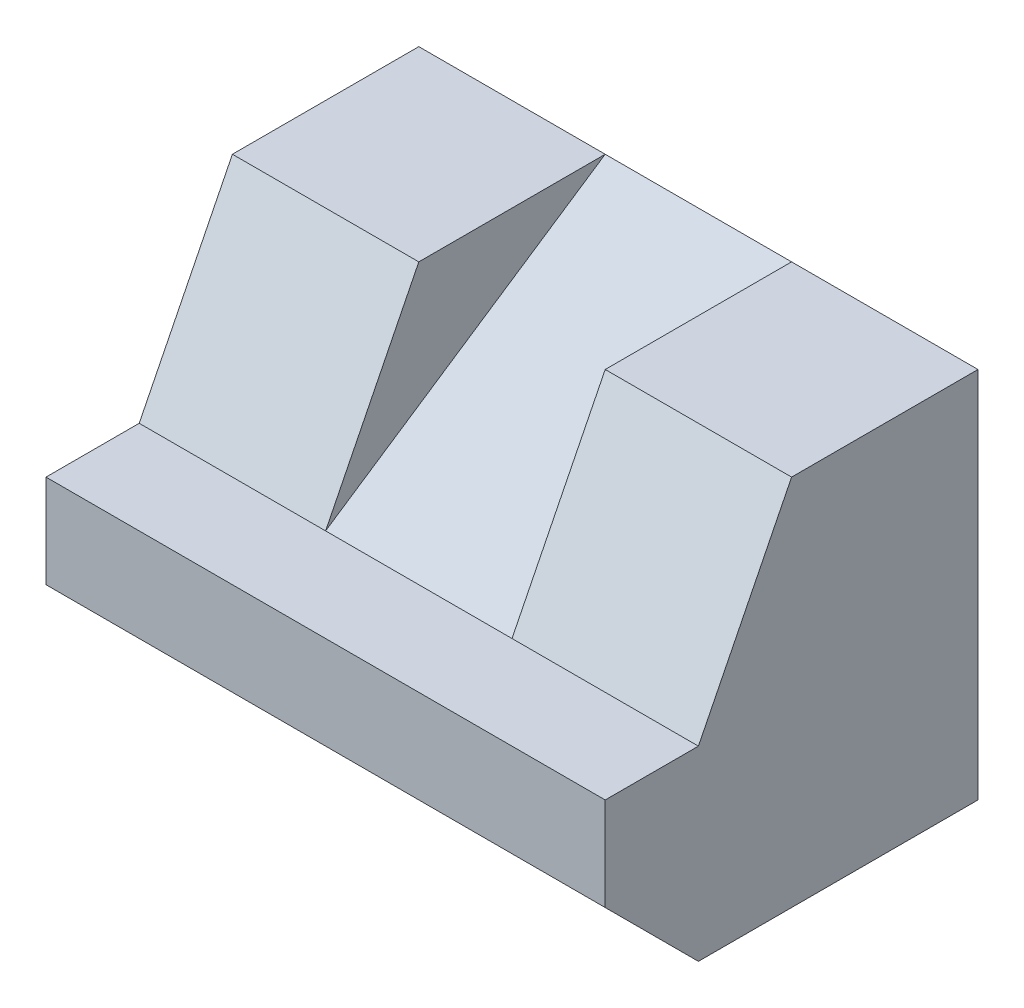
ISO-10303-21;
HEADER;
FILE_DESCRIPTION(('STEP AP214'),'2;1');
FILE_NAME('part.step','',(''),(''),'','','');
FILE_SCHEMA(('AUTOMOTIVE_DESIGN { 1 0 10303 214 1 1 1 1 }'));
ENDSEC;
DATA;
#1=APPLICATION_CONTEXT('core data for automotive mechanical design processes');
#2=APPLICATION_PROTOCOL_DEFINITION('international standard','automotive_design',2000,#1);
#3=PRODUCT_CONTEXT('',#1,'mechanical');
#4=PRODUCT('Part','Part','',(#3));
#5=PRODUCT_RELATED_PRODUCT_CATEGORY('part','',(#4));
#6=PRODUCT_DEFINITION_FORMATION('','',#4);
#7=PRODUCT_DEFINITION_CONTEXT('part definition',#1,'design');
#8=PRODUCT_DEFINITION('design','',#6,#7);
#9=PRODUCT_DEFINITION_SHAPE('','',#8);
#10=(LENGTH_UNIT() NAMED_UNIT(*) SI_UNIT(.MILLI.,.METRE.));
#11=(NAMED_UNIT(*) PLANE_ANGLE_UNIT() SI_UNIT($,.RADIAN.));
#12=(NAMED_UNIT(*) SI_UNIT($,.STERADIAN.) SOLID_ANGLE_UNIT());
#13=UNCERTAINTY_MEASURE_WITH_UNIT(LENGTH_MEASURE(1.E-05),#10,'distance_accuracy_value','');
#14=(GEOMETRIC_REPRESENTATION_CONTEXT(3) GLOBAL_UNCERTAINTY_ASSIGNED_CONTEXT((#13)) GLOBAL_UNIT_ASSIGNED_CONTEXT((#10,
#11,#12)) REPRESENTATION_CONTEXT('',''));
#15=CARTESIAN_POINT('',(0.,0.,0.));
#16=DIRECTION('',(0.,0.,1.));
#17=DIRECTION('',(1.,0.,0.));
#18=AXIS2_PLACEMENT_3D('',#15,#16,#17);
#19=CARTESIAN_POINT('',(76.2,50.8,-38.1));
#20=DIRECTION('',(0.,-1.,0.));
#21=DIRECTION('',(0.,0.,-1.));
#22=AXIS2_PLACEMENT_3D('',#19,#20,#21);
#23=PLANE('',#22);
#24=DIRECTION('',(0.,0.,1.));
#25=VECTOR('',#24,1.);
#26=CARTESIAN_POINT('',(50.8,50.8,-38.1));
#27=LINE('',#26,#25);
#28=CARTESIAN_POINT('',(50.8,50.8,-38.1));
#29=VERTEX_POINT('',#28);
#30=CARTESIAN_POINT('',(50.8,50.8,-12.7));
#31=VERTEX_POINT('',#30);
#32=EDGE_CURVE('E208',#29,#31,#27,.T.);
#33=ORIENTED_EDGE('',*,*,#32,.T.);
#34=DIRECTION('',(-1.,0.,0.));
#35=VECTOR('',#34,1.);
#36=CARTESIAN_POINT('',(76.2,50.8,-12.7));
#37=LINE('',#36,#35);
#38=CARTESIAN_POINT('',(76.2,50.8,-12.7));
#39=VERTEX_POINT('',#38);
#40=EDGE_CURVE('E168',#39,#31,#37,.T.);
#41=ORIENTED_EDGE('',*,*,#40,.F.);
#42=DIRECTION('',(0.,0.,1.));
#43=VECTOR('',#42,1.);
#44=CARTESIAN_POINT('',(76.2,50.8,-38.1));
#45=LINE('',#44,#43);
#46=CARTESIAN_POINT('',(76.2,50.8,-38.1));
#47=VERTEX_POINT('',#46);
#48=EDGE_CURVE('E123',#47,#39,#45,.T.);
#49=ORIENTED_EDGE('',*,*,#48,.F.);
#50=DIRECTION('',(-1.,0.,0.));
#51=VECTOR('',#50,1.);
#52=CARTESIAN_POINT('',(76.2,50.8,-38.1));
#53=LINE('',#52,#51);
#54=EDGE_CURVE('E171',#47,#29,#53,.T.);
#55=ORIENTED_EDGE('',*,*,#54,.T.);
#56=EDGE_LOOP('',(#33,#41,#49,#55));
#57=FACE_BOUND('',#56,.T.);
#58=ADVANCED_FACE('F41',(#57),#23,.F.);
#59=CARTESIAN_POINT('',(76.2,50.8,-12.7));
#60=DIRECTION('',(0.,-0.447213595499958,-0.894427190999916));
#61=DIRECTION('',(0.,0.894427190999916,-0.447213595499958));
#62=AXIS2_PLACEMENT_3D('',#59,#60,#61);
#63=PLANE('',#62);
#64=DIRECTION('',(0.,-0.894427190999916,0.447213595499958));
#65=VECTOR('',#64,1.);
#66=CARTESIAN_POINT('',(50.8,50.8,-12.7));
#67=LINE('',#66,#65);
#68=CARTESIAN_POINT('',(50.8,25.4,0.));
#69=VERTEX_POINT('',#68);
#70=EDGE_CURVE('E134',#31,#69,#67,.T.);
#71=ORIENTED_EDGE('',*,*,#70,.T.);
#72=DIRECTION('',(-1.,0.,0.));
#73=VECTOR('',#72,1.);
#74=CARTESIAN_POINT('',(76.2,25.4,0.));
#75=LINE('',#74,#73);
#76=CARTESIAN_POINT('',(76.2,25.4,0.));
#77=VERTEX_POINT('',#76);
#78=EDGE_CURVE('E130',#77,#69,#75,.T.);
#79=ORIENTED_EDGE('',*,*,#78,.F.);
#80=DIRECTION('',(0.,-0.894427190999916,0.447213595499958));
#81=VECTOR('',#80,1.);
#82=CARTESIAN_POINT('',(76.2,50.8,-12.7));
#83=LINE('',#82,#81);
#84=EDGE_CURVE('E116',#39,#77,#83,.T.);
#85=ORIENTED_EDGE('',*,*,#84,.F.);
#86=ORIENTED_EDGE('',*,*,#40,.T.);
#87=EDGE_LOOP('',(#71,#79,#85,#86));
#88=FACE_BOUND('',#87,.T.);
#89=ADVANCED_FACE('F131',(#88),#63,.F.);
#90=CARTESIAN_POINT('',(76.2,12.7,12.7));
#91=DIRECTION('',(0.,0.707106781186547,-0.707106781186548));
#92=DIRECTION('',(0.,0.707106781186548,0.707106781186547));
#93=AXIS2_PLACEMENT_3D('',#90,#91,#92);
#94=PLANE('',#93);
#95=DIRECTION('',(0.,-0.707106781186548,-0.707106781186547));
#96=VECTOR('',#95,1.);
#97=CARTESIAN_POINT('',(0.,12.7,12.7));
#98=LINE('',#97,#96);
#99=CARTESIAN_POINT('',(0.,12.7,12.7));
#100=VERTEX_POINT('',#99);
#101=CARTESIAN_POINT('',(0.,0.,0.));
#102=VERTEX_POINT('',#101);
#103=EDGE_CURVE('E147',#100,#102,#98,.T.);
#104=ORIENTED_EDGE('',*,*,#103,.T.);
#105=DIRECTION('',(-1.,0.,0.));
#106=VECTOR('',#105,1.);
#107=CARTESIAN_POINT('',(76.2,0.,0.));
#108=LINE('',#107,#106);
#109=CARTESIAN_POINT('',(76.2,0.,0.));
#110=VERTEX_POINT('',#109);
#111=EDGE_CURVE('E11',#110,#102,#108,.T.);
#112=ORIENTED_EDGE('',*,*,#111,.F.);
#113=DIRECTION('',(0.,-0.707106781186548,-0.707106781186547));
#114=VECTOR('',#113,1.);
#115=CARTESIAN_POINT('',(76.2,12.7,12.7));
#116=LINE('',#115,#114);
#117=CARTESIAN_POINT('',(76.2,12.7,12.7));
#118=VERTEX_POINT('',#117);
#119=EDGE_CURVE('E165',#118,#110,#116,.T.);
#120=ORIENTED_EDGE('',*,*,#119,.F.);
#121=DIRECTION('',(-1.,0.,0.));
#122=VECTOR('',#121,1.);
#123=CARTESIAN_POINT('',(76.2,12.7,12.7));
#124=LINE('',#123,#122);
#125=EDGE_CURVE('E143',#118,#100,#124,.T.);
#126=ORIENTED_EDGE('',*,*,#125,.T.);
#127=EDGE_LOOP('',(#104,#112,#120,#126));
#128=FACE_BOUND('',#127,.T.);
#129=ADVANCED_FACE('F43',(#128),#94,.F.);
#130=CARTESIAN_POINT('',(76.2,0.,0.));
#131=DIRECTION('',(0.,1.,0.));
#132=DIRECTION('',(0.,0.,1.));
#133=AXIS2_PLACEMENT_3D('',#130,#131,#132);
#134=PLANE('',#133);
#135=DIRECTION('',(0.,0.,-1.));
#136=VECTOR('',#135,1.);
#137=CARTESIAN_POINT('',(0.,0.,0.));
#138=LINE('',#137,#136);
#139=CARTESIAN_POINT('',(0.,0.,-38.1));
#140=VERTEX_POINT('',#139);
#141=EDGE_CURVE('E150',#102,#140,#138,.T.);
#142=ORIENTED_EDGE('',*,*,#141,.T.);
#143=DIRECTION('',(-1.,0.,0.));
#144=VECTOR('',#143,1.);
#145=CARTESIAN_POINT('',(76.2,0.,-38.1));
#146=LINE('',#145,#144);
#147=CARTESIAN_POINT('',(76.2,0.,-38.1));
#148=VERTEX_POINT('',#147);
#149=EDGE_CURVE('E49',#148,#140,#146,.T.);
#150=ORIENTED_EDGE('',*,*,#149,.F.);
#151=DIRECTION('',(0.,0.,-1.));
#152=VECTOR('',#151,1.);
#153=CARTESIAN_POINT('',(76.2,0.,0.));
#154=LINE('',#153,#152);
#155=EDGE_CURVE('E103',#110,#148,#154,.T.);
#156=ORIENTED_EDGE('',*,*,#155,.F.);
#157=ORIENTED_EDGE('',*,*,#111,.T.);
#158=EDGE_LOOP('',(#142,#150,#156,#157));
#159=FACE_BOUND('',#158,.T.);
#160=ADVANCED_FACE('F234',(#159),#134,.F.);
#161=CARTESIAN_POINT('',(76.2,0.,-38.1));
#162=DIRECTION('',(0.,0.,1.));
#163=DIRECTION('',(1.,0.,0.));
#164=AXIS2_PLACEMENT_3D('',#161,#162,#163);
#165=PLANE('',#164);
#166=DIRECTION('',(0.,1.,0.));
#167=VECTOR('',#166,1.);
#168=CARTESIAN_POINT('',(0.,0.,-38.1));
#169=LINE('',#168,#167);
#170=CARTESIAN_POINT('',(0.,50.8,-38.1));
#171=VERTEX_POINT('',#170);
#172=EDGE_CURVE('E153',#140,#171,#169,.T.);
#173=ORIENTED_EDGE('',*,*,#172,.T.);
#174=CARTESIAN_POINT('',(25.4,50.8,-38.1));
#175=VERTEX_POINT('',#174);
#176=EDGE_CURVE('E170',#175,#171,#53,.T.);
#177=ORIENTED_EDGE('',*,*,#176,.F.);
#178=DIRECTION('',(1.,0.,0.));
#179=VECTOR('',#178,1.);
#180=CARTESIAN_POINT('',(25.4,50.8,-38.1));
#181=LINE('',#180,#179);
#182=EDGE_CURVE('E151',#175,#29,#181,.T.);
#183=ORIENTED_EDGE('',*,*,#182,.T.);
#184=ORIENTED_EDGE('',*,*,#54,.F.);
#185=DIRECTION('',(0.,1.,0.));
#186=VECTOR('',#185,1.);
#187=CARTESIAN_POINT('',(76.2,0.,-38.1));
#188=LINE('',#187,#186);
#189=EDGE_CURVE('E181',#148,#47,#188,.T.);
#190=ORIENTED_EDGE('',*,*,#189,.F.);
#191=ORIENTED_EDGE('',*,*,#149,.T.);
#192=EDGE_LOOP('',(#173,#177,#183,#184,#190,#191));
#193=FACE_BOUND('',#192,.T.);
#194=ADVANCED_FACE('F177',(#193),#165,.F.);
#195=CARTESIAN_POINT('',(25.4,50.8,-12.7));
#196=VERTEX_POINT('',#195);
#197=CARTESIAN_POINT('',(0.,50.8,-12.7));
#198=VERTEX_POINT('',#197);
#199=EDGE_CURVE('E137',#196,#198,#37,.T.);
#200=ORIENTED_EDGE('',*,*,#199,.F.);
#201=DIRECTION('',(0.,0.,1.));
#202=VECTOR('',#201,1.);
#203=CARTESIAN_POINT('',(25.4,50.8,-38.1));
#204=LINE('',#203,#202);
#205=EDGE_CURVE('E192',#175,#196,#204,.T.);
#206=ORIENTED_EDGE('',*,*,#205,.F.);
#207=ORIENTED_EDGE('',*,*,#176,.T.);
#208=DIRECTION('',(0.,0.,1.));
#209=VECTOR('',#208,1.);
#210=CARTESIAN_POINT('',(0.,50.8,-38.1));
#211=LINE('',#210,#209);
#212=EDGE_CURVE('E156',#171,#198,#211,.T.);
#213=ORIENTED_EDGE('',*,*,#212,.T.);
#214=EDGE_LOOP('',(#200,#206,#207,#213));
#215=FACE_BOUND('',#214,.T.);
#216=ADVANCED_FACE('F189',(#215),#23,.F.);
#217=CARTESIAN_POINT('',(25.4,25.4,0.));
#218=VERTEX_POINT('',#217);
#219=CARTESIAN_POINT('',(0.,25.4,0.));
#220=VERTEX_POINT('',#219);
#221=EDGE_CURVE('E138',#218,#220,#75,.T.);
#222=ORIENTED_EDGE('',*,*,#221,.F.);
#223=DIRECTION('',(0.,-0.894427190999916,0.447213595499958));
#224=VECTOR('',#223,1.);
#225=CARTESIAN_POINT('',(25.4,50.8,-12.7));
#226=LINE('',#225,#224);
#227=EDGE_CURVE('E56',#196,#218,#226,.T.);
#228=ORIENTED_EDGE('',*,*,#227,.F.);
#229=ORIENTED_EDGE('',*,*,#199,.T.);
#230=DIRECTION('',(0.,-0.894427190999916,0.447213595499958));
#231=VECTOR('',#230,1.);
#232=CARTESIAN_POINT('',(0.,50.8,-12.7));
#233=LINE('',#232,#231);
#234=EDGE_CURVE('E159',#198,#220,#233,.T.);
#235=ORIENTED_EDGE('',*,*,#234,.T.);
#236=EDGE_LOOP('',(#222,#228,#229,#235));
#237=FACE_BOUND('',#236,.T.);
#238=ADVANCED_FACE('F227',(#237),#63,.F.);
#239=CARTESIAN_POINT('',(76.2,25.4,0.));
#240=DIRECTION('',(0.,-1.,0.));
#241=DIRECTION('',(0.,0.,-1.));
#242=AXIS2_PLACEMENT_3D('',#239,#240,#241);
#243=PLANE('',#242);
#244=DIRECTION('',(0.,0.,1.));
#245=VECTOR('',#244,1.);
#246=CARTESIAN_POINT('',(0.,25.4,0.));
#247=LINE('',#246,#245);
#248=CARTESIAN_POINT('',(0.,25.4,12.7));
#249=VERTEX_POINT('',#248);
#250=EDGE_CURVE('E162',#220,#249,#247,.T.);
#251=ORIENTED_EDGE('',*,*,#250,.T.);
#252=DIRECTION('',(-1.,0.,0.));
#253=VECTOR('',#252,1.);
#254=CARTESIAN_POINT('',(76.2,25.4,12.7));
#255=LINE('',#254,#253);
#256=CARTESIAN_POINT('',(76.2,25.4,12.7));
#257=VERTEX_POINT('',#256);
#258=EDGE_CURVE('E141',#257,#249,#255,.T.);
#259=ORIENTED_EDGE('',*,*,#258,.F.);
#260=DIRECTION('',(0.,0.,1.));
#261=VECTOR('',#260,1.);
#262=CARTESIAN_POINT('',(76.2,25.4,0.));
#263=LINE('',#262,#261);
#264=EDGE_CURVE('E120',#77,#257,#263,.T.);
#265=ORIENTED_EDGE('',*,*,#264,.F.);
#266=ORIENTED_EDGE('',*,*,#78,.T.);
#267=DIRECTION('',(1.,0.,0.));
#268=VECTOR('',#267,1.);
#269=CARTESIAN_POINT('',(25.4,25.4,0.));
#270=LINE('',#269,#268);
#271=EDGE_CURVE('E206',#218,#69,#270,.T.);
#272=ORIENTED_EDGE('',*,*,#271,.F.);
#273=ORIENTED_EDGE('',*,*,#221,.T.);
#274=EDGE_LOOP('',(#251,#259,#265,#266,#272,#273));
#275=FACE_BOUND('',#274,.T.);
#276=ADVANCED_FACE('F140',(#275),#243,.F.);
#277=CARTESIAN_POINT('',(76.2,25.4,12.7));
#278=DIRECTION('',(0.,0.,-1.));
#279=DIRECTION('',(0.,1.,0.));
#280=AXIS2_PLACEMENT_3D('',#277,#278,#279);
#281=PLANE('',#280);
#282=DIRECTION('',(0.,-1.,0.));
#283=VECTOR('',#282,1.);
#284=CARTESIAN_POINT('',(0.,25.4,12.7));
#285=LINE('',#284,#283);
#286=EDGE_CURVE('E95',#249,#100,#285,.T.);
#287=ORIENTED_EDGE('',*,*,#286,.T.);
#288=ORIENTED_EDGE('',*,*,#125,.F.);
#289=DIRECTION('',(0.,-1.,0.));
#290=VECTOR('',#289,1.);
#291=CARTESIAN_POINT('',(76.2,25.4,12.7));
#292=LINE('',#291,#290);
#293=EDGE_CURVE('E65',#257,#118,#292,.T.);
#294=ORIENTED_EDGE('',*,*,#293,.F.);
#295=ORIENTED_EDGE('',*,*,#258,.T.);
#296=EDGE_LOOP('',(#287,#288,#294,#295));
#297=FACE_BOUND('',#296,.T.);
#298=ADVANCED_FACE('F243',(#297),#281,.F.);
#299=CARTESIAN_POINT('',(76.2,0.,0.));
#300=DIRECTION('',(-1.,0.,0.));
#301=DIRECTION('',(0.,0.,1.));
#302=AXIS2_PLACEMENT_3D('',#299,#300,#301);
#303=PLANE('',#302);
#304=ORIENTED_EDGE('',*,*,#119,.T.);
#305=ORIENTED_EDGE('',*,*,#155,.T.);
#306=ORIENTED_EDGE('',*,*,#189,.T.);
#307=ORIENTED_EDGE('',*,*,#48,.T.);
#308=ORIENTED_EDGE('',*,*,#84,.T.);
#309=ORIENTED_EDGE('',*,*,#264,.T.);
#310=ORIENTED_EDGE('',*,*,#293,.T.);
#311=EDGE_LOOP('',(#304,#305,#306,#307,#308,#309,#310));
#312=FACE_BOUND('',#311,.T.);
#313=ADVANCED_FACE('F118',(#312),#303,.F.);
#314=CARTESIAN_POINT('',(0.,0.,0.));
#315=DIRECTION('',(-1.,0.,0.));
#316=DIRECTION('',(0.,0.,1.));
#317=AXIS2_PLACEMENT_3D('',#314,#315,#316);
#318=PLANE('',#317);
#319=ORIENTED_EDGE('',*,*,#103,.F.);
#320=ORIENTED_EDGE('',*,*,#286,.F.);
#321=ORIENTED_EDGE('',*,*,#250,.F.);
#322=ORIENTED_EDGE('',*,*,#234,.F.);
#323=ORIENTED_EDGE('',*,*,#212,.F.);
#324=ORIENTED_EDGE('',*,*,#172,.F.);
#325=ORIENTED_EDGE('',*,*,#141,.F.);
#326=EDGE_LOOP('',(#319,#320,#321,#322,#323,#324,#325));
#327=FACE_BOUND('',#326,.T.);
#328=ADVANCED_FACE('F184',(#327),#318,.T.);
#329=CARTESIAN_POINT('',(25.4,25.4,0.));
#330=DIRECTION('',(0.,-0.832050294337844,-0.554700196225229));
#331=DIRECTION('',(0.,0.554700196225229,-0.832050294337844));
#332=AXIS2_PLACEMENT_3D('',#329,#330,#331);
#333=PLANE('',#332);
#334=DIRECTION('',(0.,0.554700196225229,-0.832050294337844));
#335=VECTOR('',#334,1.);
#336=CARTESIAN_POINT('',(50.8,25.4,0.));
#337=LINE('',#336,#335);
#338=EDGE_CURVE('E203',#69,#29,#337,.T.);
#339=ORIENTED_EDGE('',*,*,#338,.T.);
#340=ORIENTED_EDGE('',*,*,#182,.F.);
#341=DIRECTION('',(0.,0.554700196225229,-0.832050294337844));
#342=VECTOR('',#341,1.);
#343=CARTESIAN_POINT('',(25.4,25.4,0.));
#344=LINE('',#343,#342);
#345=EDGE_CURVE('E214',#218,#175,#344,.T.);
#346=ORIENTED_EDGE('',*,*,#345,.F.);
#347=ORIENTED_EDGE('',*,*,#271,.T.);
#348=EDGE_LOOP('',(#339,#340,#346,#347));
#349=FACE_BOUND('',#348,.T.);
#350=ADVANCED_FACE('F205',(#349),#333,.F.);
#351=CARTESIAN_POINT('',(25.4,0.,0.));
#352=DIRECTION('',(-1.,0.,0.));
#353=DIRECTION('',(0.,0.,1.));
#354=AXIS2_PLACEMENT_3D('',#351,#352,#353);
#355=PLANE('',#354);
#356=ORIENTED_EDGE('',*,*,#227,.T.);
#357=ORIENTED_EDGE('',*,*,#345,.T.);
#358=ORIENTED_EDGE('',*,*,#205,.T.);
#359=EDGE_LOOP('',(#356,#357,#358));
#360=FACE_BOUND('',#359,.T.);
#361=ADVANCED_FACE('F256',(#360),#355,.F.);
#362=CARTESIAN_POINT('',(50.8,0.,0.));
#363=DIRECTION('',(-1.,0.,0.));
#364=DIRECTION('',(0.,0.,1.));
#365=AXIS2_PLACEMENT_3D('',#362,#363,#364);
#366=PLANE('',#365);
#367=ORIENTED_EDGE('',*,*,#70,.F.);
#368=ORIENTED_EDGE('',*,*,#32,.F.);
#369=ORIENTED_EDGE('',*,*,#338,.F.);
#370=EDGE_LOOP('',(#367,#368,#369));
#371=FACE_BOUND('',#370,.T.);
#372=ADVANCED_FACE('F211',(#371),#366,.T.);
#373=CLOSED_SHELL('',(#58,#89,#129,#160,#194,#216,#238,#276,#298,#313,#328,#350,#361,#372));
#374=MANIFOLD_SOLID_BREP('B2',#373);
#375=ADVANCED_BREP_SHAPE_REPRESENTATION('',(#18,#374),#14);
#376=SHAPE_DEFINITION_REPRESENTATION(#9,#375);
ENDSEC;
END-ISO-10303-21;
